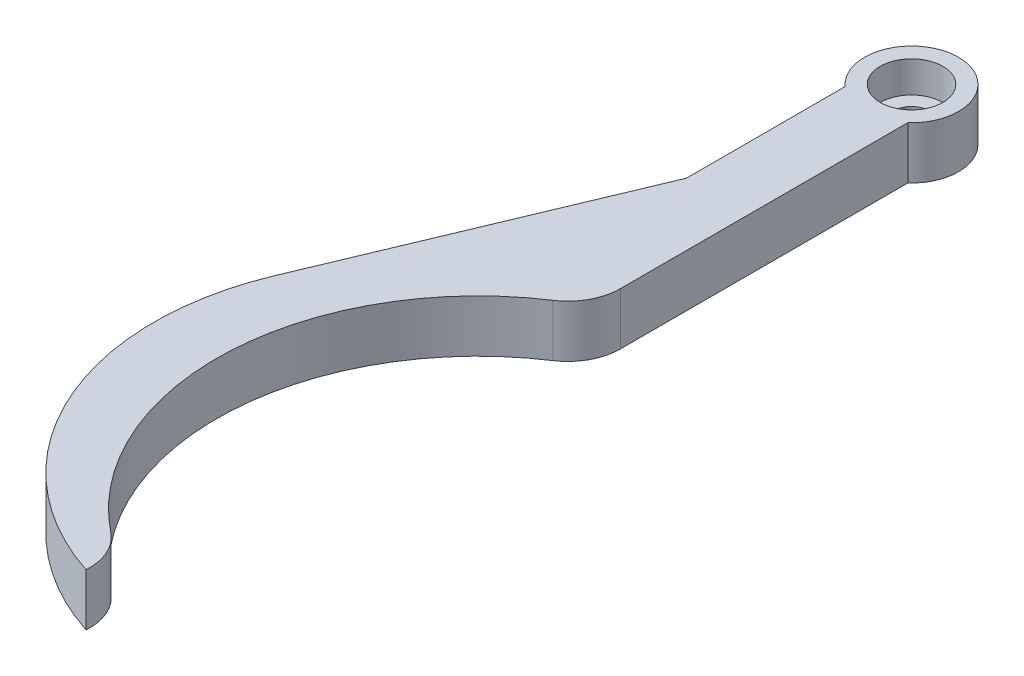
ISO-10303-21;
HEADER;
FILE_DESCRIPTION(('STEP AP214'),'2;1');
FILE_NAME('part.step','',(''),(''),'','','');
FILE_SCHEMA(('AUTOMOTIVE_DESIGN { 1 0 10303 214 1 1 1 1 }'));
ENDSEC;
DATA;
#1=APPLICATION_CONTEXT('core data for automotive mechanical design processes');
#2=APPLICATION_PROTOCOL_DEFINITION('international standard','automotive_design',2000,#1);
#3=PRODUCT_CONTEXT('',#1,'mechanical');
#4=PRODUCT('Part','Part','',(#3));
#5=PRODUCT_RELATED_PRODUCT_CATEGORY('part','',(#4));
#6=PRODUCT_DEFINITION_FORMATION('','',#4);
#7=PRODUCT_DEFINITION_CONTEXT('part definition',#1,'design');
#8=PRODUCT_DEFINITION('design','',#6,#7);
#9=PRODUCT_DEFINITION_SHAPE('','',#8);
#10=(LENGTH_UNIT() NAMED_UNIT(*) SI_UNIT(.MILLI.,.METRE.));
#11=(NAMED_UNIT(*) PLANE_ANGLE_UNIT() SI_UNIT($,.RADIAN.));
#12=(NAMED_UNIT(*) SI_UNIT($,.STERADIAN.) SOLID_ANGLE_UNIT());
#13=UNCERTAINTY_MEASURE_WITH_UNIT(LENGTH_MEASURE(1.E-05),#10,'distance_accuracy_value','');
#14=(GEOMETRIC_REPRESENTATION_CONTEXT(3) GLOBAL_UNCERTAINTY_ASSIGNED_CONTEXT((#13)) GLOBAL_UNIT_ASSIGNED_CONTEXT((#10,
#11,#12)) REPRESENTATION_CONTEXT('',''));
#15=CARTESIAN_POINT('',(0.,0.,0.));
#16=DIRECTION('',(0.,0.,1.));
#17=DIRECTION('',(1.,0.,0.));
#18=AXIS2_PLACEMENT_3D('',#15,#16,#17);
#19=CARTESIAN_POINT('',(8.4495202218953,0.,55.9700991059163));
#20=DIRECTION('',(0.,1.,0.));
#21=DIRECTION('',(0.,0.,1.));
#22=AXIS2_PLACEMENT_3D('',#19,#20,#21);
#23=CYLINDRICAL_SURFACE('',#22,25.);
#24=CARTESIAN_POINT('',(8.4495202218953,5.,55.9700991059163));
#25=DIRECTION('',(0.,1.,0.));
#26=DIRECTION('',(0.,0.,1.));
#27=AXIS2_PLACEMENT_3D('',#24,#25,#26);
#28=CIRCLE('',#27,25.);
#29=CARTESIAN_POINT('',(-14.6149676840736,5.,46.3249242689621));
#30=VERTEX_POINT('',#29);
#31=CARTESIAN_POINT('',(0.722500961257982,5.,79.7459939018171));
#32=VERTEX_POINT('',#31);
#33=EDGE_CURVE('E195',#30,#32,#28,.T.);
#34=ORIENTED_EDGE('',*,*,#33,.F.);
#35=DIRECTION('',(0.,1.,0.));
#36=VECTOR('',#35,1.);
#37=CARTESIAN_POINT('',(-14.6149676840736,0.,46.3249242689621));
#38=LINE('',#37,#36);
#39=CARTESIAN_POINT('',(-14.6149676840736,0.,46.3249242689621));
#40=VERTEX_POINT('',#39);
#41=EDGE_CURVE('E119',#40,#30,#38,.T.);
#42=ORIENTED_EDGE('',*,*,#41,.F.);
#43=CARTESIAN_POINT('',(8.4495202218953,0.,55.9700991059163));
#44=DIRECTION('',(0.,1.,0.));
#45=DIRECTION('',(0.,0.,1.));
#46=AXIS2_PLACEMENT_3D('',#43,#44,#45);
#47=CIRCLE('',#46,25.);
#48=CARTESIAN_POINT('',(0.722500961257982,0.,79.7459939018171));
#49=VERTEX_POINT('',#48);
#50=EDGE_CURVE('E128',#40,#49,#47,.T.);
#51=ORIENTED_EDGE('',*,*,#50,.T.);
#52=DIRECTION('',(0.,1.,0.));
#53=VECTOR('',#52,1.);
#54=CARTESIAN_POINT('',(0.722500961257982,0.,79.7459939018171));
#55=LINE('',#54,#53);
#56=EDGE_CURVE('E183',#49,#32,#55,.T.);
#57=ORIENTED_EDGE('',*,*,#56,.T.);
#58=EDGE_LOOP('',(#34,#42,#51,#57));
#59=FACE_BOUND('',#58,.T.);
#60=ADVANCED_FACE('F43',(#59),#23,.T.);
#61=CARTESIAN_POINT('',(0.,-4.66690475583121,0.));
#62=DIRECTION('',(0.,1.,0.));
#63=DIRECTION('',(0.,0.,1.));
#64=AXIS2_PLACEMENT_3D('',#61,#62,#63);
#65=CYLINDRICAL_SURFACE('',#64,1.65);
#66=CARTESIAN_POINT('',(0.,0.,0.));
#67=DIRECTION('',(0.,1.,0.));
#68=DIRECTION('',(0.,0.,1.));
#69=AXIS2_PLACEMENT_3D('',#66,#67,#68);
#70=CIRCLE('',#69,1.65);
#71=CARTESIAN_POINT('',(0.,0.,1.65));
#72=VERTEX_POINT('',#71);
#73=EDGE_CURVE('E189',#72,#72,#70,.F.);
#74=ORIENTED_EDGE('',*,*,#73,.T.);
#75=EDGE_LOOP('',(#74));
#76=FACE_BOUND('',#75,.T.);
#77=CARTESIAN_POINT('',(0.,2.,0.));
#78=DIRECTION('',(0.,1.,0.));
#79=DIRECTION('',(0.,0.,1.));
#80=AXIS2_PLACEMENT_3D('',#77,#78,#79);
#81=CIRCLE('',#80,1.65);
#82=CARTESIAN_POINT('',(0.,2.,1.65));
#83=VERTEX_POINT('',#82);
#84=EDGE_CURVE('E155',#83,#83,#81,.F.);
#85=ORIENTED_EDGE('',*,*,#84,.F.);
#86=EDGE_LOOP('',(#85));
#87=FACE_BOUND('',#86,.T.);
#88=ADVANCED_FACE('F252',(#76,#87),#65,.F.);
#89=CARTESIAN_POINT('',(3.,5.,3.35410196624968));
#90=DIRECTION('',(-1.,0.,0.));
#91=DIRECTION('',(0.,0.,1.));
#92=AXIS2_PLACEMENT_3D('',#89,#90,#91);
#93=PLANE('',#92);
#94=DIRECTION('',(0.,0.,-1.));
#95=VECTOR('',#94,1.);
#96=CARTESIAN_POINT('',(3.00000000000001,5.,43.8541019662497));
#97=LINE('',#96,#95);
#98=CARTESIAN_POINT('',(3.,5.,30.8819886854511));
#99=VERTEX_POINT('',#98);
#100=CARTESIAN_POINT('',(3.,5.,3.35410196624968));
#101=VERTEX_POINT('',#100);
#102=EDGE_CURVE('E141',#99,#101,#97,.T.);
#103=ORIENTED_EDGE('',*,*,#102,.F.);
#104=DIRECTION('',(0.,-1.,0.));
#105=VECTOR('',#104,1.);
#106=CARTESIAN_POINT('',(3.00000000000001,0.,30.8819886854511));
#107=LINE('',#106,#105);
#108=CARTESIAN_POINT('',(3.00000000000001,0.,30.8819886854511));
#109=VERTEX_POINT('',#108);
#110=EDGE_CURVE('E11',#99,#109,#107,.T.);
#111=ORIENTED_EDGE('',*,*,#110,.T.);
#112=DIRECTION('',(0.,0.,-1.));
#113=VECTOR('',#112,1.);
#114=CARTESIAN_POINT('',(3.,0.,3.35410196624968));
#115=LINE('',#114,#113);
#116=CARTESIAN_POINT('',(3.,0.,3.35410196624968));
#117=VERTEX_POINT('',#116);
#118=EDGE_CURVE('E143',#109,#117,#115,.T.);
#119=ORIENTED_EDGE('',*,*,#118,.T.);
#120=DIRECTION('',(0.,-1.,0.));
#121=VECTOR('',#120,1.);
#122=CARTESIAN_POINT('',(3.,5.,3.35410196624968));
#123=LINE('',#122,#121);
#124=EDGE_CURVE('E149',#101,#117,#123,.T.);
#125=ORIENTED_EDGE('',*,*,#124,.F.);
#126=EDGE_LOOP('',(#103,#111,#119,#125));
#127=FACE_BOUND('',#126,.T.);
#128=ADVANCED_FACE('F204',(#127),#93,.F.);
#129=CARTESIAN_POINT('',(0.,5.,0.));
#130=DIRECTION('',(0.,-1.,0.));
#131=DIRECTION('',(0.,0.,-1.));
#132=AXIS2_PLACEMENT_3D('',#129,#130,#131);
#133=CYLINDRICAL_SURFACE('',#132,4.5);
#134=CARTESIAN_POINT('',(0.,0.,0.));
#135=DIRECTION('',(0.,1.,0.));
#136=DIRECTION('',(0.,0.,1.));
#137=AXIS2_PLACEMENT_3D('',#134,#135,#136);
#138=CIRCLE('',#137,4.5);
#139=CARTESIAN_POINT('',(-3.,0.,3.35410196624968));
#140=VERTEX_POINT('',#139);
#141=EDGE_CURVE('E137',#117,#140,#138,.T.);
#142=ORIENTED_EDGE('',*,*,#141,.T.);
#143=DIRECTION('',(0.,-1.,0.));
#144=VECTOR('',#143,1.);
#145=CARTESIAN_POINT('',(-3.,5.,3.35410196624968));
#146=LINE('',#145,#144);
#147=CARTESIAN_POINT('',(-3.,5.,3.35410196624968));
#148=VERTEX_POINT('',#147);
#149=EDGE_CURVE('E134',#148,#140,#146,.T.);
#150=ORIENTED_EDGE('',*,*,#149,.F.);
#151=CARTESIAN_POINT('',(0.,5.,0.));
#152=DIRECTION('',(0.,1.,0.));
#153=DIRECTION('',(0.,0.,1.));
#154=AXIS2_PLACEMENT_3D('',#151,#152,#153);
#155=CIRCLE('',#154,4.5);
#156=EDGE_CURVE('E150',#101,#148,#155,.T.);
#157=ORIENTED_EDGE('',*,*,#156,.F.);
#158=ORIENTED_EDGE('',*,*,#124,.T.);
#159=EDGE_LOOP('',(#142,#150,#157,#158));
#160=FACE_BOUND('',#159,.T.);
#161=ADVANCED_FACE('F207',(#160),#133,.T.);
#162=CARTESIAN_POINT('',(-3.,5.,3.35410196624968));
#163=DIRECTION('',(1.,0.,0.));
#164=DIRECTION('',(0.,0.,-1.));
#165=AXIS2_PLACEMENT_3D('',#162,#163,#164);
#166=PLANE('',#165);
#167=DIRECTION('',(0.,0.,1.));
#168=VECTOR('',#167,1.);
#169=CARTESIAN_POINT('',(-3.,0.,3.35410196624968));
#170=LINE('',#169,#168);
#171=CARTESIAN_POINT('',(-2.99999999999999,0.,18.5500745429482));
#172=VERTEX_POINT('',#171);
#173=EDGE_CURVE('E126',#140,#172,#170,.T.);
#174=ORIENTED_EDGE('',*,*,#173,.T.);
#175=DIRECTION('',(0.,1.,0.));
#176=VECTOR('',#175,1.);
#177=CARTESIAN_POINT('',(-2.99999999999999,0.,18.5500745429482));
#178=LINE('',#177,#176);
#179=CARTESIAN_POINT('',(-2.99999999999999,5.,18.5500745429482));
#180=VERTEX_POINT('',#179);
#181=EDGE_CURVE('E108',#172,#180,#178,.T.);
#182=ORIENTED_EDGE('',*,*,#181,.T.);
#183=DIRECTION('',(0.,0.,1.));
#184=VECTOR('',#183,1.);
#185=CARTESIAN_POINT('',(-3.,5.,7.41619848709566));
#186=LINE('',#185,#184);
#187=EDGE_CURVE('E136',#148,#180,#186,.T.);
#188=ORIENTED_EDGE('',*,*,#187,.F.);
#189=ORIENTED_EDGE('',*,*,#149,.T.);
#190=EDGE_LOOP('',(#174,#182,#188,#189));
#191=FACE_BOUND('',#190,.T.);
#192=ADVANCED_FACE('F132',(#191),#166,.F.);
#193=CARTESIAN_POINT('',(0.,5.,0.));
#194=DIRECTION('',(0.,1.,0.));
#195=DIRECTION('',(0.,0.,1.));
#196=AXIS2_PLACEMENT_3D('',#193,#194,#195);
#197=PLANE('',#196);
#198=ORIENTED_EDGE('',*,*,#33,.T.);
#199=CARTESIAN_POINT('',(-4.26659309038037,5.,79.4159324773719));
#200=DIRECTION('',(0.,1.,0.));
#201=DIRECTION('',(0.,0.,1.));
#202=AXIS2_PLACEMENT_3D('',#199,#200,#201);
#203=CIRCLE('',#202,5.);
#204=CARTESIAN_POINT('',(-1.14724087166777,5.,75.5082935821293));
#205=VERTEX_POINT('',#204);
#206=EDGE_CURVE('E163',#32,#205,#203,.T.);
#207=ORIENTED_EDGE('',*,*,#206,.T.);
#208=CARTESIAN_POINT('',(14.4495202218953,5.,55.9700991059163));
#209=DIRECTION('',(0.,-1.,0.));
#210=DIRECTION('',(0.,0.,1.));
#211=AXIS2_PLACEMENT_3D('',#208,#209,#210);
#212=CIRCLE('',#211,25.);
#213=CARTESIAN_POINT('',(0.741586703649219,5.,35.0633404221953));
#214=VERTEX_POINT('',#213);
#215=EDGE_CURVE('E159',#205,#214,#212,.T.);
#216=ORIENTED_EDGE('',*,*,#215,.T.);
#217=CARTESIAN_POINT('',(-1.99999999999999,5.,30.8819886854511));
#218=DIRECTION('',(0.,1.,0.));
#219=DIRECTION('',(0.,0.,1.));
#220=AXIS2_PLACEMENT_3D('',#217,#218,#219);
#221=CIRCLE('',#220,5.);
#222=EDGE_CURVE('E154',#214,#99,#221,.T.);
#223=ORIENTED_EDGE('',*,*,#222,.T.);
#224=ORIENTED_EDGE('',*,*,#102,.T.);
#225=ORIENTED_EDGE('',*,*,#156,.T.);
#226=ORIENTED_EDGE('',*,*,#187,.T.);
#227=DIRECTION('',(-0.38580699347817,0.,0.922579516238755));
#228=VECTOR('',#227,1.);
#229=CARTESIAN_POINT('',(-2.99999999999999,5.,18.5500745429482));
#230=LINE('',#229,#228);
#231=EDGE_CURVE('E114',#180,#30,#230,.T.);
#232=ORIENTED_EDGE('',*,*,#231,.T.);
#233=EDGE_LOOP('',(#198,#207,#216,#223,#224,#225,#226,#232));
#234=FACE_BOUND('',#233,.T.);
#235=CARTESIAN_POINT('',(0.,5.,0.));
#236=DIRECTION('',(0.,1.,0.));
#237=DIRECTION('',(0.,0.,1.));
#238=AXIS2_PLACEMENT_3D('',#235,#236,#237);
#239=CIRCLE('',#238,3.);
#240=CARTESIAN_POINT('',(0.,5.,3.));
#241=VERTEX_POINT('',#240);
#242=EDGE_CURVE('E222',#241,#241,#239,.T.);
#243=ORIENTED_EDGE('',*,*,#242,.F.);
#244=EDGE_LOOP('',(#243));
#245=FACE_BOUND('',#244,.T.);
#246=ADVANCED_FACE('F209',(#234,#245),#197,.T.);
#247=CARTESIAN_POINT('',(0.,0.,0.));
#248=DIRECTION('',(0.,1.,0.));
#249=DIRECTION('',(0.,0.,1.));
#250=AXIS2_PLACEMENT_3D('',#247,#248,#249);
#251=PLANE('',#250);
#252=CARTESIAN_POINT('',(14.4495202218953,0.,55.9700991059163));
#253=DIRECTION('',(0.,-1.,0.));
#254=DIRECTION('',(0.,0.,1.));
#255=AXIS2_PLACEMENT_3D('',#252,#253,#254);
#256=CIRCLE('',#255,25.);
#257=CARTESIAN_POINT('',(-1.14724087166776,0.,75.5082935821293));
#258=VERTEX_POINT('',#257);
#259=CARTESIAN_POINT('',(0.741586703649219,0.,35.0633404221953));
#260=VERTEX_POINT('',#259);
#261=EDGE_CURVE('E176',#258,#260,#256,.T.);
#262=ORIENTED_EDGE('',*,*,#261,.F.);
#263=CARTESIAN_POINT('',(-4.26659309038037,0.,79.4159324773719));
#264=DIRECTION('',(0.,1.,0.));
#265=DIRECTION('',(0.,0.,1.));
#266=AXIS2_PLACEMENT_3D('',#263,#264,#265);
#267=CIRCLE('',#266,5.);
#268=EDGE_CURVE('E52',#258,#49,#267,.F.);
#269=ORIENTED_EDGE('',*,*,#268,.T.);
#270=ORIENTED_EDGE('',*,*,#50,.F.);
#271=DIRECTION('',(-0.38580699347817,0.,0.922579516238755));
#272=VECTOR('',#271,1.);
#273=CARTESIAN_POINT('',(-2.99999999999999,0.,18.5500745429482));
#274=LINE('',#273,#272);
#275=EDGE_CURVE('E112',#172,#40,#274,.T.);
#276=ORIENTED_EDGE('',*,*,#275,.F.);
#277=ORIENTED_EDGE('',*,*,#173,.F.);
#278=ORIENTED_EDGE('',*,*,#141,.F.);
#279=ORIENTED_EDGE('',*,*,#118,.F.);
#280=CARTESIAN_POINT('',(-1.99999999999999,0.,30.8819886854511));
#281=DIRECTION('',(0.,1.,0.));
#282=DIRECTION('',(0.,0.,1.));
#283=AXIS2_PLACEMENT_3D('',#280,#281,#282);
#284=CIRCLE('',#283,5.);
#285=EDGE_CURVE('E64',#109,#260,#284,.F.);
#286=ORIENTED_EDGE('',*,*,#285,.T.);
#287=EDGE_LOOP('',(#262,#269,#270,#276,#277,#278,#279,#286));
#288=FACE_BOUND('',#287,.T.);
#289=ORIENTED_EDGE('',*,*,#73,.F.);
#290=EDGE_LOOP('',(#289));
#291=FACE_BOUND('',#290,.T.);
#292=ADVANCED_FACE('F123',(#288,#291),#251,.F.);
#293=CARTESIAN_POINT('',(14.4495202218953,0.,55.9700991059163));
#294=DIRECTION('',(0.,1.,0.));
#295=DIRECTION('',(0.,0.,1.));
#296=AXIS2_PLACEMENT_3D('',#293,#294,#295);
#297=CYLINDRICAL_SURFACE('',#296,25.);
#298=ORIENTED_EDGE('',*,*,#215,.F.);
#299=DIRECTION('',(0.,1.,0.));
#300=VECTOR('',#299,1.);
#301=CARTESIAN_POINT('',(-1.14724087166777,0.,75.5082935821293));
#302=LINE('',#301,#300);
#303=EDGE_CURVE('E170',#205,#258,#302,.F.);
#304=ORIENTED_EDGE('',*,*,#303,.T.);
#305=ORIENTED_EDGE('',*,*,#261,.T.);
#306=DIRECTION('',(0.,1.,0.));
#307=VECTOR('',#306,1.);
#308=CARTESIAN_POINT('',(0.741586703649219,0.,35.0633404221953));
#309=LINE('',#308,#307);
#310=EDGE_CURVE('E166',#260,#214,#309,.T.);
#311=ORIENTED_EDGE('',*,*,#310,.T.);
#312=EDGE_LOOP('',(#298,#304,#305,#311));
#313=FACE_BOUND('',#312,.T.);
#314=ADVANCED_FACE('F216',(#313),#297,.F.);
#315=CARTESIAN_POINT('',(0.,2.,0.));
#316=DIRECTION('',(0.,1.,0.));
#317=DIRECTION('',(0.,0.,1.));
#318=AXIS2_PLACEMENT_3D('',#315,#316,#317);
#319=PLANE('',#318);
#320=CARTESIAN_POINT('',(0.,2.,0.));
#321=DIRECTION('',(0.,1.,0.));
#322=DIRECTION('',(0.,0.,1.));
#323=AXIS2_PLACEMENT_3D('',#320,#321,#322);
#324=CIRCLE('',#323,3.);
#325=CARTESIAN_POINT('',(0.,2.,3.));
#326=VERTEX_POINT('',#325);
#327=EDGE_CURVE('E160',#326,#326,#324,.T.);
#328=ORIENTED_EDGE('',*,*,#327,.T.);
#329=EDGE_LOOP('',(#328));
#330=FACE_BOUND('',#329,.T.);
#331=ORIENTED_EDGE('',*,*,#84,.T.);
#332=EDGE_LOOP('',(#331));
#333=FACE_BOUND('',#332,.T.);
#334=ADVANCED_FACE('F234',(#330,#333),#319,.T.);
#335=CARTESIAN_POINT('',(0.,2.,0.));
#336=DIRECTION('',(0.,1.,0.));
#337=DIRECTION('',(0.,0.,1.));
#338=AXIS2_PLACEMENT_3D('',#335,#336,#337);
#339=CYLINDRICAL_SURFACE('',#338,3.);
#340=ORIENTED_EDGE('',*,*,#327,.F.);
#341=EDGE_LOOP('',(#340));
#342=FACE_BOUND('',#341,.T.);
#343=ORIENTED_EDGE('',*,*,#242,.T.);
#344=EDGE_LOOP('',(#343));
#345=FACE_BOUND('',#344,.T.);
#346=ADVANCED_FACE('F237',(#342,#345),#339,.F.);
#347=CARTESIAN_POINT('',(-2.99999999999999,0.,18.5500745429482));
#348=DIRECTION('',(-0.922579516238755,0.,-0.38580699347817));
#349=DIRECTION('',(-0.38580699347817,0.,0.922579516238755));
#350=AXIS2_PLACEMENT_3D('',#347,#348,#349);
#351=PLANE('',#350);
#352=ORIENTED_EDGE('',*,*,#231,.F.);
#353=ORIENTED_EDGE('',*,*,#181,.F.);
#354=ORIENTED_EDGE('',*,*,#275,.T.);
#355=ORIENTED_EDGE('',*,*,#41,.T.);
#356=EDGE_LOOP('',(#352,#353,#354,#355));
#357=FACE_BOUND('',#356,.T.);
#358=ADVANCED_FACE('F110',(#357),#351,.T.);
#359=CARTESIAN_POINT('',(-4.26659309038037,0.,79.4159324773719));
#360=DIRECTION('',(0.,1.,0.));
#361=DIRECTION('',(0.,0.,1.));
#362=AXIS2_PLACEMENT_3D('',#359,#360,#361);
#363=CYLINDRICAL_SURFACE('',#362,5.);
#364=ORIENTED_EDGE('',*,*,#268,.F.);
#365=ORIENTED_EDGE('',*,*,#303,.F.);
#366=ORIENTED_EDGE('',*,*,#206,.F.);
#367=ORIENTED_EDGE('',*,*,#56,.F.);
#368=EDGE_LOOP('',(#364,#365,#366,#367));
#369=FACE_BOUND('',#368,.T.);
#370=ADVANCED_FACE('F186',(#369),#363,.T.);
#371=CARTESIAN_POINT('',(-1.99999999999999,0.,30.8819886854511));
#372=DIRECTION('',(0.,1.,0.));
#373=DIRECTION('',(0.,0.,1.));
#374=AXIS2_PLACEMENT_3D('',#371,#372,#373);
#375=CYLINDRICAL_SURFACE('',#374,5.);
#376=ORIENTED_EDGE('',*,*,#285,.F.);
#377=ORIENTED_EDGE('',*,*,#110,.F.);
#378=ORIENTED_EDGE('',*,*,#222,.F.);
#379=ORIENTED_EDGE('',*,*,#310,.F.);
#380=EDGE_LOOP('',(#376,#377,#378,#379));
#381=FACE_BOUND('',#380,.T.);
#382=ADVANCED_FACE('F45',(#381),#375,.T.);
#383=CLOSED_SHELL('',(#60,#88,#128,#161,#192,#246,#292,#314,#334,#346,#358,#370,#382));
#384=MANIFOLD_SOLID_BREP('B2',#383);
#385=ADVANCED_BREP_SHAPE_REPRESENTATION('',(#18,#384),#14);
#386=SHAPE_DEFINITION_REPRESENTATION(#9,#385);
ENDSEC;
END-ISO-10303-21;
